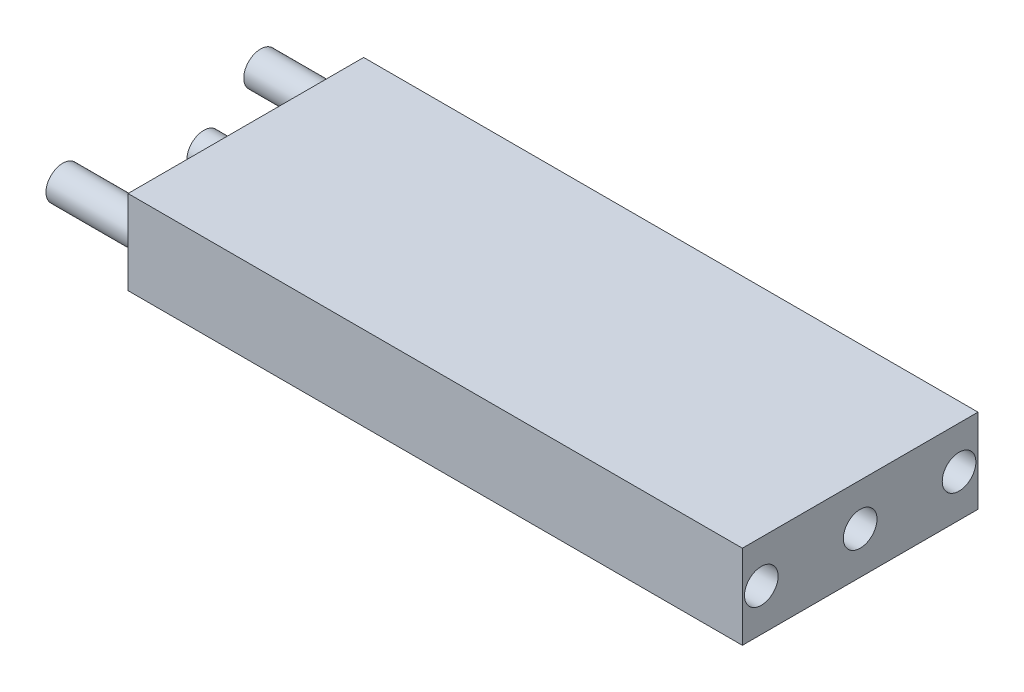
ISO-10303-21;
HEADER;
FILE_DESCRIPTION(('STEP AP214'),'2;1');
FILE_NAME('part.step','',(''),(''),'','','');
FILE_SCHEMA(('AUTOMOTIVE_DESIGN { 1 0 10303 214 1 1 1 1 }'));
ENDSEC;
DATA;
#1=APPLICATION_CONTEXT('core data for automotive mechanical design processes');
#2=APPLICATION_PROTOCOL_DEFINITION('international standard','automotive_design',2000,#1);
#3=PRODUCT_CONTEXT('',#1,'mechanical');
#4=PRODUCT('Part','Part','',(#3));
#5=PRODUCT_RELATED_PRODUCT_CATEGORY('part','',(#4));
#6=PRODUCT_DEFINITION_FORMATION('','',#4);
#7=PRODUCT_DEFINITION_CONTEXT('part definition',#1,'design');
#8=PRODUCT_DEFINITION('design','',#6,#7);
#9=PRODUCT_DEFINITION_SHAPE('','',#8);
#10=(LENGTH_UNIT() NAMED_UNIT(*) SI_UNIT(.MILLI.,.METRE.));
#11=(NAMED_UNIT(*) PLANE_ANGLE_UNIT() SI_UNIT($,.RADIAN.));
#12=(NAMED_UNIT(*) SI_UNIT($,.STERADIAN.) SOLID_ANGLE_UNIT());
#13=UNCERTAINTY_MEASURE_WITH_UNIT(LENGTH_MEASURE(1.E-05),#10,'distance_accuracy_value','');
#14=(GEOMETRIC_REPRESENTATION_CONTEXT(3) GLOBAL_UNCERTAINTY_ASSIGNED_CONTEXT((#13)) GLOBAL_UNIT_ASSIGNED_CONTEXT((#10,
#11,#12)) REPRESENTATION_CONTEXT('',''));
#15=CARTESIAN_POINT('',(0.,0.,0.));
#16=DIRECTION('',(0.,0.,1.));
#17=DIRECTION('',(1.,0.,0.));
#18=AXIS2_PLACEMENT_3D('',#15,#16,#17);
#19=CARTESIAN_POINT('',(36.5,5.,14.));
#20=DIRECTION('',(-1.,0.,0.));
#21=DIRECTION('',(0.,0.,1.));
#22=AXIS2_PLACEMENT_3D('',#19,#20,#21);
#23=PLANE('',#22);
#24=CARTESIAN_POINT('',(36.5,0.,11.75));
#25=DIRECTION('',(-1.,0.,0.));
#26=DIRECTION('',(0.,0.,1.));
#27=AXIS2_PLACEMENT_3D('',#24,#25,#26);
#28=CIRCLE('',#27,2.);
#29=CARTESIAN_POINT('',(36.5,0.,13.75));
#30=VERTEX_POINT('',#29);
#31=EDGE_CURVE('E167',#30,#30,#28,.T.);
#32=ORIENTED_EDGE('',*,*,#31,.T.);
#33=EDGE_LOOP('',(#32));
#34=FACE_BOUND('',#33,.T.);
#35=CARTESIAN_POINT('',(36.5,0.,-11.75));
#36=DIRECTION('',(-1.,0.,0.));
#37=DIRECTION('',(0.,0.,1.));
#38=AXIS2_PLACEMENT_3D('',#35,#36,#37);
#39=CIRCLE('',#38,2.);
#40=CARTESIAN_POINT('',(36.5,0.,-9.75));
#41=VERTEX_POINT('',#40);
#42=EDGE_CURVE('E171',#41,#41,#39,.T.);
#43=ORIENTED_EDGE('',*,*,#42,.T.);
#44=EDGE_LOOP('',(#43));
#45=FACE_BOUND('',#44,.T.);
#46=CARTESIAN_POINT('',(36.5,0.,0.));
#47=DIRECTION('',(-1.,0.,0.));
#48=DIRECTION('',(0.,0.,1.));
#49=AXIS2_PLACEMENT_3D('',#46,#47,#48);
#50=CIRCLE('',#49,2.);
#51=CARTESIAN_POINT('',(36.5,0.,2.));
#52=VERTEX_POINT('',#51);
#53=EDGE_CURVE('E175',#52,#52,#50,.T.);
#54=ORIENTED_EDGE('',*,*,#53,.T.);
#55=EDGE_LOOP('',(#54));
#56=FACE_BOUND('',#55,.T.);
#57=DIRECTION('',(0.,0.,-1.));
#58=VECTOR('',#57,1.);
#59=CARTESIAN_POINT('',(36.5,-5.,14.));
#60=LINE('',#59,#58);
#61=CARTESIAN_POINT('',(36.5,-5.,14.));
#62=VERTEX_POINT('',#61);
#63=CARTESIAN_POINT('',(36.5,-5.,-14.));
#64=VERTEX_POINT('',#63);
#65=EDGE_CURVE('E116',#62,#64,#60,.T.);
#66=ORIENTED_EDGE('',*,*,#65,.T.);
#67=DIRECTION('',(0.,-1.,0.));
#68=VECTOR('',#67,1.);
#69=CARTESIAN_POINT('',(36.5,5.,-14.));
#70=LINE('',#69,#68);
#71=CARTESIAN_POINT('',(36.5,5.,-14.));
#72=VERTEX_POINT('',#71);
#73=EDGE_CURVE('E107',#72,#64,#70,.T.);
#74=ORIENTED_EDGE('',*,*,#73,.F.);
#75=DIRECTION('',(0.,0.,-1.));
#76=VECTOR('',#75,1.);
#77=CARTESIAN_POINT('',(36.5,5.,14.));
#78=LINE('',#77,#76);
#79=CARTESIAN_POINT('',(36.5,5.,14.));
#80=VERTEX_POINT('',#79);
#81=EDGE_CURVE('E101',#80,#72,#78,.T.);
#82=ORIENTED_EDGE('',*,*,#81,.F.);
#83=DIRECTION('',(0.,-1.,0.));
#84=VECTOR('',#83,1.);
#85=CARTESIAN_POINT('',(36.5,5.,14.));
#86=LINE('',#85,#84);
#87=EDGE_CURVE('E112',#80,#62,#86,.T.);
#88=ORIENTED_EDGE('',*,*,#87,.T.);
#89=EDGE_LOOP('',(#66,#74,#82,#88));
#90=FACE_BOUND('',#89,.T.);
#91=ADVANCED_FACE('F49',(#34,#45,#56,#90),#23,.F.);
#92=CARTESIAN_POINT('',(-36.5,5.,-14.));
#93=DIRECTION('',(0.,0.,1.));
#94=DIRECTION('',(1.,0.,0.));
#95=AXIS2_PLACEMENT_3D('',#92,#93,#94);
#96=PLANE('',#95);
#97=DIRECTION('',(-1.,0.,0.));
#98=VECTOR('',#97,1.);
#99=CARTESIAN_POINT('',(-36.5,-5.,-14.));
#100=LINE('',#99,#98);
#101=CARTESIAN_POINT('',(-36.5,-5.,-14.));
#102=VERTEX_POINT('',#101);
#103=EDGE_CURVE('E106',#64,#102,#100,.T.);
#104=ORIENTED_EDGE('',*,*,#103,.T.);
#105=DIRECTION('',(0.,-1.,0.));
#106=VECTOR('',#105,1.);
#107=CARTESIAN_POINT('',(-36.5,5.,-14.));
#108=LINE('',#107,#106);
#109=CARTESIAN_POINT('',(-36.5,5.,-14.));
#110=VERTEX_POINT('',#109);
#111=EDGE_CURVE('E104',#110,#102,#108,.T.);
#112=ORIENTED_EDGE('',*,*,#111,.F.);
#113=DIRECTION('',(-1.,0.,0.));
#114=VECTOR('',#113,1.);
#115=CARTESIAN_POINT('',(-36.5,5.,-14.));
#116=LINE('',#115,#114);
#117=EDGE_CURVE('E96',#72,#110,#116,.T.);
#118=ORIENTED_EDGE('',*,*,#117,.F.);
#119=ORIENTED_EDGE('',*,*,#73,.T.);
#120=EDGE_LOOP('',(#104,#112,#118,#119));
#121=FACE_BOUND('',#120,.T.);
#122=ADVANCED_FACE('F105',(#121),#96,.F.);
#123=CARTESIAN_POINT('',(-36.5,5.,14.));
#124=DIRECTION('',(1.,0.,0.));
#125=DIRECTION('',(0.,0.,-1.));
#126=AXIS2_PLACEMENT_3D('',#123,#124,#125);
#127=PLANE('',#126);
#128=CARTESIAN_POINT('',(-36.5,0.,0.));
#129=DIRECTION('',(1.,0.,0.));
#130=DIRECTION('',(0.,0.,-1.));
#131=AXIS2_PLACEMENT_3D('',#128,#129,#130);
#132=CIRCLE('',#131,2.);
#133=CARTESIAN_POINT('',(-36.5,0.,-2.));
#134=VERTEX_POINT('',#133);
#135=EDGE_CURVE('E11',#134,#134,#132,.F.);
#136=ORIENTED_EDGE('',*,*,#135,.F.);
#137=EDGE_LOOP('',(#136));
#138=FACE_BOUND('',#137,.T.);
#139=CARTESIAN_POINT('',(-36.5,0.,11.75));
#140=DIRECTION('',(1.,0.,0.));
#141=DIRECTION('',(0.,0.,-1.));
#142=AXIS2_PLACEMENT_3D('',#139,#140,#141);
#143=CIRCLE('',#142,2.);
#144=CARTESIAN_POINT('',(-36.5,0.,9.75));
#145=VERTEX_POINT('',#144);
#146=EDGE_CURVE('E57',#145,#145,#143,.F.);
#147=ORIENTED_EDGE('',*,*,#146,.F.);
#148=EDGE_LOOP('',(#147));
#149=FACE_BOUND('',#148,.T.);
#150=CARTESIAN_POINT('',(-36.5,0.,-11.75));
#151=DIRECTION('',(1.,0.,0.));
#152=DIRECTION('',(0.,0.,-1.));
#153=AXIS2_PLACEMENT_3D('',#150,#151,#152);
#154=CIRCLE('',#153,2.);
#155=CARTESIAN_POINT('',(-36.5,0.,-13.75));
#156=VERTEX_POINT('',#155);
#157=EDGE_CURVE('E126',#156,#156,#154,.F.);
#158=ORIENTED_EDGE('',*,*,#157,.F.);
#159=EDGE_LOOP('',(#158));
#160=FACE_BOUND('',#159,.T.);
#161=DIRECTION('',(0.,0.,1.));
#162=VECTOR('',#161,1.);
#163=CARTESIAN_POINT('',(-36.5,-5.,14.));
#164=LINE('',#163,#162);
#165=CARTESIAN_POINT('',(-36.5,-5.,14.));
#166=VERTEX_POINT('',#165);
#167=EDGE_CURVE('E82',#102,#166,#164,.T.);
#168=ORIENTED_EDGE('',*,*,#167,.T.);
#169=DIRECTION('',(0.,-1.,0.));
#170=VECTOR('',#169,1.);
#171=CARTESIAN_POINT('',(-36.5,5.,14.));
#172=LINE('',#171,#170);
#173=CARTESIAN_POINT('',(-36.5,5.,14.));
#174=VERTEX_POINT('',#173);
#175=EDGE_CURVE('E108',#174,#166,#172,.T.);
#176=ORIENTED_EDGE('',*,*,#175,.F.);
#177=DIRECTION('',(0.,0.,1.));
#178=VECTOR('',#177,1.);
#179=CARTESIAN_POINT('',(-36.5,5.,14.));
#180=LINE('',#179,#178);
#181=EDGE_CURVE('E99',#110,#174,#180,.T.);
#182=ORIENTED_EDGE('',*,*,#181,.F.);
#183=ORIENTED_EDGE('',*,*,#111,.T.);
#184=EDGE_LOOP('',(#168,#176,#182,#183));
#185=FACE_BOUND('',#184,.T.);
#186=ADVANCED_FACE('F110',(#138,#149,#160,#185),#127,.F.);
#187=CARTESIAN_POINT('',(-36.5,5.,14.));
#188=DIRECTION('',(0.,0.,-1.));
#189=DIRECTION('',(-1.,0.,0.));
#190=AXIS2_PLACEMENT_3D('',#187,#188,#189);
#191=PLANE('',#190);
#192=DIRECTION('',(1.,0.,0.));
#193=VECTOR('',#192,1.);
#194=CARTESIAN_POINT('',(-36.5,-5.,14.));
#195=LINE('',#194,#193);
#196=EDGE_CURVE('E88',#166,#62,#195,.T.);
#197=ORIENTED_EDGE('',*,*,#196,.T.);
#198=ORIENTED_EDGE('',*,*,#87,.F.);
#199=DIRECTION('',(1.,0.,0.));
#200=VECTOR('',#199,1.);
#201=CARTESIAN_POINT('',(-36.5,5.,14.));
#202=LINE('',#201,#200);
#203=EDGE_CURVE('E65',#174,#80,#202,.T.);
#204=ORIENTED_EDGE('',*,*,#203,.F.);
#205=ORIENTED_EDGE('',*,*,#175,.T.);
#206=EDGE_LOOP('',(#197,#198,#204,#205));
#207=FACE_BOUND('',#206,.T.);
#208=ADVANCED_FACE('F135',(#207),#191,.F.);
#209=CARTESIAN_POINT('',(0.,5.,0.));
#210=DIRECTION('',(0.,-1.,0.));
#211=DIRECTION('',(0.,0.,-1.));
#212=AXIS2_PLACEMENT_3D('',#209,#210,#211);
#213=PLANE('',#212);
#214=ORIENTED_EDGE('',*,*,#81,.T.);
#215=ORIENTED_EDGE('',*,*,#117,.T.);
#216=ORIENTED_EDGE('',*,*,#181,.T.);
#217=ORIENTED_EDGE('',*,*,#203,.T.);
#218=EDGE_LOOP('',(#214,#215,#216,#217));
#219=FACE_BOUND('',#218,.T.);
#220=ADVANCED_FACE('F97',(#219),#213,.F.);
#221=CARTESIAN_POINT('',(0.,-5.,0.));
#222=DIRECTION('',(0.,-1.,0.));
#223=DIRECTION('',(0.,0.,-1.));
#224=AXIS2_PLACEMENT_3D('',#221,#222,#223);
#225=PLANE('',#224);
#226=ORIENTED_EDGE('',*,*,#65,.F.);
#227=ORIENTED_EDGE('',*,*,#196,.F.);
#228=ORIENTED_EDGE('',*,*,#167,.F.);
#229=ORIENTED_EDGE('',*,*,#103,.F.);
#230=EDGE_LOOP('',(#226,#227,#228,#229));
#231=FACE_BOUND('',#230,.T.);
#232=ADVANCED_FACE('F178',(#231),#225,.T.);
#233=CARTESIAN_POINT('',(31.5,0.,0.));
#234=DIRECTION('',(1.,0.,0.));
#235=DIRECTION('',(0.,0.,-1.));
#236=AXIS2_PLACEMENT_3D('',#233,#234,#235);
#237=CYLINDRICAL_SURFACE('',#236,2.);
#238=CARTESIAN_POINT('',(31.5,0.,0.));
#239=DIRECTION('',(-1.,0.,0.));
#240=DIRECTION('',(0.,0.,1.));
#241=AXIS2_PLACEMENT_3D('',#238,#239,#240);
#242=CIRCLE('',#241,2.);
#243=CARTESIAN_POINT('',(31.5,0.,2.));
#244=VERTEX_POINT('',#243);
#245=EDGE_CURVE('E119',#244,#244,#242,.T.);
#246=ORIENTED_EDGE('',*,*,#245,.T.);
#247=EDGE_LOOP('',(#246));
#248=FACE_BOUND('',#247,.T.);
#249=ORIENTED_EDGE('',*,*,#53,.F.);
#250=EDGE_LOOP('',(#249));
#251=FACE_BOUND('',#250,.T.);
#252=ADVANCED_FACE('F179',(#248,#251),#237,.F.);
#253=CARTESIAN_POINT('',(31.5,0.,0.));
#254=DIRECTION('',(-1.,0.,0.));
#255=DIRECTION('',(0.,0.,1.));
#256=AXIS2_PLACEMENT_3D('',#253,#254,#255);
#257=PLANE('',#256);
#258=ORIENTED_EDGE('',*,*,#245,.F.);
#259=EDGE_LOOP('',(#258));
#260=FACE_BOUND('',#259,.T.);
#261=ADVANCED_FACE('F184',(#260),#257,.F.);
#262=CARTESIAN_POINT('',(31.5,0.,-11.75));
#263=DIRECTION('',(1.,0.,0.));
#264=DIRECTION('',(0.,0.,-1.));
#265=AXIS2_PLACEMENT_3D('',#262,#263,#264);
#266=CYLINDRICAL_SURFACE('',#265,2.);
#267=CARTESIAN_POINT('',(31.5,0.,-11.75));
#268=DIRECTION('',(-1.,0.,0.));
#269=DIRECTION('',(0.,0.,1.));
#270=AXIS2_PLACEMENT_3D('',#267,#268,#269);
#271=CIRCLE('',#270,2.);
#272=CARTESIAN_POINT('',(31.5,0.,-9.75));
#273=VERTEX_POINT('',#272);
#274=EDGE_CURVE('E342',#273,#273,#271,.T.);
#275=ORIENTED_EDGE('',*,*,#274,.T.);
#276=EDGE_LOOP('',(#275));
#277=FACE_BOUND('',#276,.T.);
#278=ORIENTED_EDGE('',*,*,#42,.F.);
#279=EDGE_LOOP('',(#278));
#280=FACE_BOUND('',#279,.T.);
#281=ADVANCED_FACE('F220',(#277,#280),#266,.F.);
#282=CARTESIAN_POINT('',(31.5,0.,-11.75));
#283=DIRECTION('',(-1.,0.,0.));
#284=DIRECTION('',(0.,0.,1.));
#285=AXIS2_PLACEMENT_3D('',#282,#283,#284);
#286=PLANE('',#285);
#287=ORIENTED_EDGE('',*,*,#274,.F.);
#288=EDGE_LOOP('',(#287));
#289=FACE_BOUND('',#288,.T.);
#290=ADVANCED_FACE('F230',(#289),#286,.F.);
#291=CARTESIAN_POINT('',(31.5,0.,11.75));
#292=DIRECTION('',(1.,0.,0.));
#293=DIRECTION('',(0.,0.,-1.));
#294=AXIS2_PLACEMENT_3D('',#291,#292,#293);
#295=CYLINDRICAL_SURFACE('',#294,2.);
#296=CARTESIAN_POINT('',(31.5,0.,11.75));
#297=DIRECTION('',(-1.,0.,0.));
#298=DIRECTION('',(0.,0.,1.));
#299=AXIS2_PLACEMENT_3D('',#296,#297,#298);
#300=CIRCLE('',#299,2.);
#301=CARTESIAN_POINT('',(31.5,0.,13.75));
#302=VERTEX_POINT('',#301);
#303=EDGE_CURVE('E340',#302,#302,#300,.T.);
#304=ORIENTED_EDGE('',*,*,#303,.T.);
#305=EDGE_LOOP('',(#304));
#306=FACE_BOUND('',#305,.T.);
#307=ORIENTED_EDGE('',*,*,#31,.F.);
#308=EDGE_LOOP('',(#307));
#309=FACE_BOUND('',#308,.T.);
#310=ADVANCED_FACE('F152',(#306,#309),#295,.F.);
#311=CARTESIAN_POINT('',(31.5,0.,11.75));
#312=DIRECTION('',(-1.,0.,0.));
#313=DIRECTION('',(0.,0.,1.));
#314=AXIS2_PLACEMENT_3D('',#311,#312,#313);
#315=PLANE('',#314);
#316=ORIENTED_EDGE('',*,*,#303,.F.);
#317=EDGE_LOOP('',(#316));
#318=FACE_BOUND('',#317,.T.);
#319=ADVANCED_FACE('F143',(#318),#315,.F.);
#320=CARTESIAN_POINT('',(-26.5,0.,-11.75));
#321=DIRECTION('',(-1.,0.,0.));
#322=DIRECTION('',(0.,0.,1.));
#323=AXIS2_PLACEMENT_3D('',#320,#321,#322);
#324=CYLINDRICAL_SURFACE('',#323,2.);
#325=CARTESIAN_POINT('',(-46.5,0.,-11.75));
#326=DIRECTION('',(1.,0.,0.));
#327=DIRECTION('',(0.,0.,-1.));
#328=AXIS2_PLACEMENT_3D('',#325,#326,#327);
#329=CIRCLE('',#328,2.);
#330=CARTESIAN_POINT('',(-46.5,0.,-13.75));
#331=VERTEX_POINT('',#330);
#332=EDGE_CURVE('E336',#331,#331,#329,.T.);
#333=ORIENTED_EDGE('',*,*,#332,.T.);
#334=EDGE_LOOP('',(#333));
#335=FACE_BOUND('',#334,.T.);
#336=ORIENTED_EDGE('',*,*,#157,.T.);
#337=EDGE_LOOP('',(#336));
#338=FACE_BOUND('',#337,.T.);
#339=ADVANCED_FACE('F140',(#335,#338),#324,.T.);
#340=CARTESIAN_POINT('',(-46.5,0.,-11.75));
#341=DIRECTION('',(1.,0.,0.));
#342=DIRECTION('',(0.,0.,-1.));
#343=AXIS2_PLACEMENT_3D('',#340,#341,#342);
#344=PLANE('',#343);
#345=ORIENTED_EDGE('',*,*,#332,.F.);
#346=EDGE_LOOP('',(#345));
#347=FACE_BOUND('',#346,.T.);
#348=ADVANCED_FACE('F142',(#347),#344,.F.);
#349=CARTESIAN_POINT('',(-26.5,0.,11.75));
#350=DIRECTION('',(-1.,0.,0.));
#351=DIRECTION('',(0.,0.,1.));
#352=AXIS2_PLACEMENT_3D('',#349,#350,#351);
#353=CYLINDRICAL_SURFACE('',#352,2.);
#354=CARTESIAN_POINT('',(-46.5,0.,11.75));
#355=DIRECTION('',(1.,0.,0.));
#356=DIRECTION('',(0.,0.,-1.));
#357=AXIS2_PLACEMENT_3D('',#354,#355,#356);
#358=CIRCLE('',#357,2.);
#359=CARTESIAN_POINT('',(-46.5,0.,9.75));
#360=VERTEX_POINT('',#359);
#361=EDGE_CURVE('E333',#360,#360,#358,.T.);
#362=ORIENTED_EDGE('',*,*,#361,.T.);
#363=EDGE_LOOP('',(#362));
#364=FACE_BOUND('',#363,.T.);
#365=ORIENTED_EDGE('',*,*,#146,.T.);
#366=EDGE_LOOP('',(#365));
#367=FACE_BOUND('',#366,.T.);
#368=ADVANCED_FACE('F131',(#364,#367),#353,.T.);
#369=CARTESIAN_POINT('',(-46.5,0.,11.75));
#370=DIRECTION('',(1.,0.,0.));
#371=DIRECTION('',(0.,0.,-1.));
#372=AXIS2_PLACEMENT_3D('',#369,#370,#371);
#373=PLANE('',#372);
#374=ORIENTED_EDGE('',*,*,#361,.F.);
#375=EDGE_LOOP('',(#374));
#376=FACE_BOUND('',#375,.T.);
#377=ADVANCED_FACE('F279',(#376),#373,.F.);
#378=CARTESIAN_POINT('',(-31.5,0.,0.));
#379=DIRECTION('',(-1.,0.,0.));
#380=DIRECTION('',(0.,0.,1.));
#381=AXIS2_PLACEMENT_3D('',#378,#379,#380);
#382=CYLINDRICAL_SURFACE('',#381,2.);
#383=CARTESIAN_POINT('',(-41.5,0.,0.));
#384=DIRECTION('',(1.,0.,0.));
#385=DIRECTION('',(0.,0.,-1.));
#386=AXIS2_PLACEMENT_3D('',#383,#384,#385);
#387=CIRCLE('',#386,2.);
#388=CARTESIAN_POINT('',(-41.5,0.,-2.));
#389=VERTEX_POINT('',#388);
#390=EDGE_CURVE('E332',#389,#389,#387,.T.);
#391=ORIENTED_EDGE('',*,*,#390,.T.);
#392=EDGE_LOOP('',(#391));
#393=FACE_BOUND('',#392,.T.);
#394=ORIENTED_EDGE('',*,*,#135,.T.);
#395=EDGE_LOOP('',(#394));
#396=FACE_BOUND('',#395,.T.);
#397=ADVANCED_FACE('F291',(#393,#396),#382,.T.);
#398=CARTESIAN_POINT('',(-41.5,0.,0.));
#399=DIRECTION('',(1.,0.,0.));
#400=DIRECTION('',(0.,0.,-1.));
#401=AXIS2_PLACEMENT_3D('',#398,#399,#400);
#402=PLANE('',#401);
#403=ORIENTED_EDGE('',*,*,#390,.F.);
#404=EDGE_LOOP('',(#403));
#405=FACE_BOUND('',#404,.T.);
#406=ADVANCED_FACE('F303',(#405),#402,.F.);
#407=CLOSED_SHELL('',(#91,#122,#186,#208,#220,#232,#252,#261,#281,#290,#310,#319,#339,#348,#368,
#377,#397,#406));
#408=MANIFOLD_SOLID_BREP('B2',#407);
#409=ADVANCED_BREP_SHAPE_REPRESENTATION('',(#18,#408),#14);
#410=SHAPE_DEFINITION_REPRESENTATION(#9,#409);
ENDSEC;
END-ISO-10303-21;
